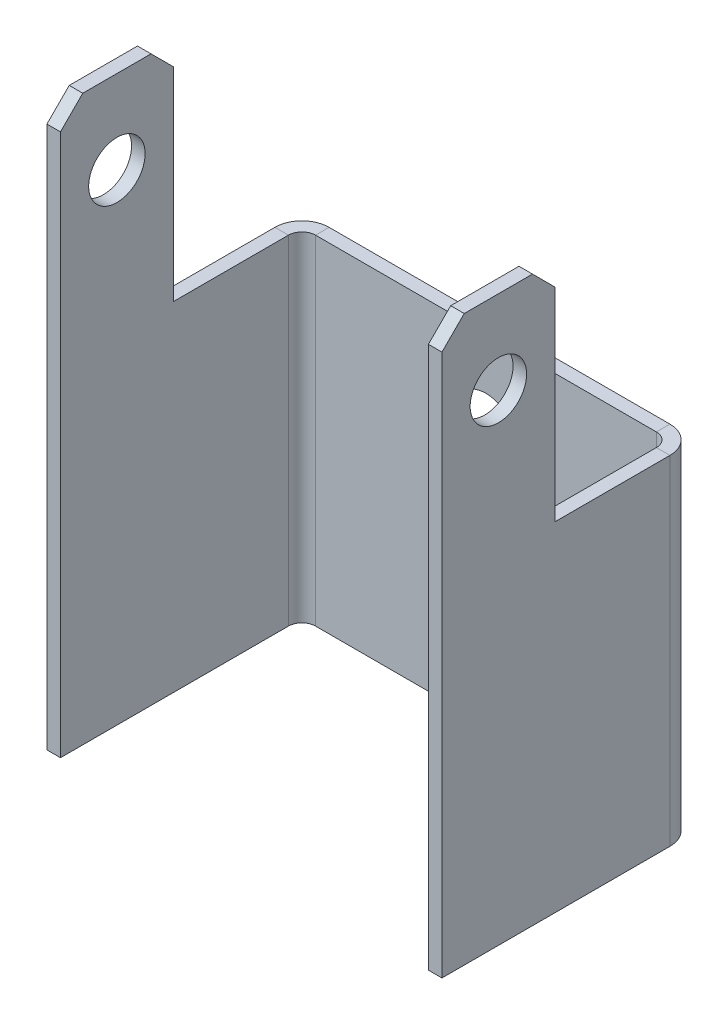
ISO-10303-21;
HEADER;
FILE_DESCRIPTION(('STEP AP214'),'2;1');
FILE_NAME('part.step','',(''),(''),'','','');
FILE_SCHEMA(('AUTOMOTIVE_DESIGN { 1 0 10303 214 1 1 1 1 }'));
ENDSEC;
DATA;
#1=APPLICATION_CONTEXT('core data for automotive mechanical design processes');
#2=APPLICATION_PROTOCOL_DEFINITION('international standard','automotive_design',2000,#1);
#3=PRODUCT_CONTEXT('',#1,'mechanical');
#4=PRODUCT('Part','Part','',(#3));
#5=PRODUCT_RELATED_PRODUCT_CATEGORY('part','',(#4));
#6=PRODUCT_DEFINITION_FORMATION('','',#4);
#7=PRODUCT_DEFINITION_CONTEXT('part definition',#1,'design');
#8=PRODUCT_DEFINITION('design','',#6,#7);
#9=PRODUCT_DEFINITION_SHAPE('','',#8);
#10=(LENGTH_UNIT() NAMED_UNIT(*) SI_UNIT(.MILLI.,.METRE.));
#11=(NAMED_UNIT(*) PLANE_ANGLE_UNIT() SI_UNIT($,.RADIAN.));
#12=(NAMED_UNIT(*) SI_UNIT($,.STERADIAN.) SOLID_ANGLE_UNIT());
#13=UNCERTAINTY_MEASURE_WITH_UNIT(LENGTH_MEASURE(1.E-05),#10,'distance_accuracy_value','');
#14=(GEOMETRIC_REPRESENTATION_CONTEXT(3) GLOBAL_UNCERTAINTY_ASSIGNED_CONTEXT((#13)) GLOBAL_UNIT_ASSIGNED_CONTEXT((#10,
#11,#12)) REPRESENTATION_CONTEXT('',''));
#15=CARTESIAN_POINT('',(0.,0.,0.));
#16=DIRECTION('',(0.,0.,1.));
#17=DIRECTION('',(1.,0.,0.));
#18=AXIS2_PLACEMENT_3D('',#15,#16,#17);
#19=CARTESIAN_POINT('',(-40.513,6.35000000000007,-1.52399999999979));
#20=DIRECTION('',(0.,-1.,0.));
#21=DIRECTION('',(1.,0.,0.));
#22=AXIS2_PLACEMENT_3D('',#19,#20,#21);
#23=PLANE('',#22);
#24=DIRECTION('',(0.,0.,-1.));
#25=VECTOR('',#24,1.);
#26=CARTESIAN_POINT('',(-20.701,6.35000000000007,0.));
#27=LINE('',#26,#25);
#28=CARTESIAN_POINT('',(-20.7010000000001,6.35000000000007,14.4780000000001));
#29=VERTEX_POINT('',#28);
#30=CARTESIAN_POINT('',(-20.701,6.35000000000007,1.52399999999999));
#31=VERTEX_POINT('',#30);
#32=EDGE_CURVE('E326',#29,#31,#27,.T.);
#33=ORIENTED_EDGE('',*,*,#32,.T.);
#34=DIRECTION('',(-1.,0.,0.));
#35=VECTOR('',#34,1.);
#36=CARTESIAN_POINT('',(-20.701,6.35000000000007,1.52399999999999));
#37=LINE('',#36,#35);
#38=CARTESIAN_POINT('',(-22.225,6.35000000000007,1.52399999999999));
#39=VERTEX_POINT('',#38);
#40=EDGE_CURVE('E339',#31,#39,#37,.T.);
#41=ORIENTED_EDGE('',*,*,#40,.T.);
#42=DIRECTION('',(0.,0.,-1.));
#43=VECTOR('',#42,1.);
#44=CARTESIAN_POINT('',(-22.225,6.35000000000007,0.));
#45=LINE('',#44,#43);
#46=CARTESIAN_POINT('',(-22.2250000000001,6.35000000000007,14.4780000000001));
#47=VERTEX_POINT('',#46);
#48=EDGE_CURVE('E407',#47,#39,#45,.T.);
#49=ORIENTED_EDGE('',*,*,#48,.F.);
#50=DIRECTION('',(1.,0.,0.));
#51=VECTOR('',#50,1.);
#52=CARTESIAN_POINT('',(-40.513,6.35000000000006,14.4780000000002));
#53=LINE('',#52,#51);
#54=EDGE_CURVE('E377',#47,#29,#53,.T.);
#55=ORIENTED_EDGE('',*,*,#54,.T.);
#56=EDGE_LOOP('',(#33,#41,#49,#55));
#57=FACE_BOUND('',#56,.T.);
#58=ADVANCED_FACE('F88',(#57),#23,.F.);
#59=DIRECTION('',(1.,0.,0.));
#60=VECTOR('',#59,1.);
#61=CARTESIAN_POINT('',(-40.513,6.35000000000007,-1.52399999999979));
#62=LINE('',#61,#60);
#63=CARTESIAN_POINT('',(-19.177,6.35000000000006,-1.52399999999987));
#64=VERTEX_POINT('',#63);
#65=CARTESIAN_POINT('',(19.177,6.35000000000007,-1.524));
#66=VERTEX_POINT('',#65);
#67=EDGE_CURVE('E323',#64,#66,#62,.T.);
#68=ORIENTED_EDGE('',*,*,#67,.F.);
#69=DIRECTION('',(0.,0.,1.));
#70=VECTOR('',#69,1.);
#71=CARTESIAN_POINT('',(-19.177,6.35000000000006,-1.52399999999987));
#72=LINE('',#71,#70);
#73=CARTESIAN_POINT('',(-19.177,6.35000000000006,0.));
#74=VERTEX_POINT('',#73);
#75=EDGE_CURVE('E336',#64,#74,#72,.T.);
#76=ORIENTED_EDGE('',*,*,#75,.T.);
#77=DIRECTION('',(1.,0.,0.));
#78=VECTOR('',#77,1.);
#79=CARTESIAN_POINT('',(0.,6.35000000000007,0.));
#80=LINE('',#79,#78);
#81=CARTESIAN_POINT('',(19.177,6.35000000000007,0.));
#82=VERTEX_POINT('',#81);
#83=EDGE_CURVE('E389',#74,#82,#80,.T.);
#84=ORIENTED_EDGE('',*,*,#83,.T.);
#85=DIRECTION('',(0.,0.,-1.));
#86=VECTOR('',#85,1.);
#87=CARTESIAN_POINT('',(19.177,6.35000000000007,0.));
#88=LINE('',#87,#86);
#89=EDGE_CURVE('E333',#82,#66,#88,.T.);
#90=ORIENTED_EDGE('',*,*,#89,.T.);
#91=EDGE_LOOP('',(#68,#76,#84,#90));
#92=FACE_BOUND('',#91,.T.);
#93=ADVANCED_FACE('F568',(#92),#23,.F.);
#94=ORIENTED_EDGE('',*,*,#40,.F.);
#95=CARTESIAN_POINT('',(-19.177,6.35000000000006,1.524));
#96=DIRECTION('',(0.,-1.,0.));
#97=DIRECTION('',(1.,0.,0.));
#98=AXIS2_PLACEMENT_3D('',#95,#96,#97);
#99=CIRCLE('',#98,1.524);
#100=EDGE_CURVE('E381',#74,#31,#99,.F.);
#101=ORIENTED_EDGE('',*,*,#100,.F.);
#102=ORIENTED_EDGE('',*,*,#75,.F.);
#103=CARTESIAN_POINT('',(-19.177,6.35000000000006,1.524));
#104=DIRECTION('',(0.,-1.,0.));
#105=DIRECTION('',(1.,0.,0.));
#106=AXIS2_PLACEMENT_3D('',#103,#104,#105);
#107=CIRCLE('',#106,3.048);
#108=EDGE_CURVE('E411',#64,#39,#107,.F.);
#109=ORIENTED_EDGE('',*,*,#108,.T.);
#110=EDGE_LOOP('',(#94,#101,#102,#109));
#111=FACE_BOUND('',#110,.T.);
#112=ADVANCED_FACE('F575',(#111),#23,.F.);
#113=DIRECTION('',(0.,0.,-1.));
#114=VECTOR('',#113,1.);
#115=CARTESIAN_POINT('',(22.225,6.35000000000007,-1.52400000000001));
#116=LINE('',#115,#114);
#117=CARTESIAN_POINT('',(22.225,6.35000000000007,14.478));
#118=VERTEX_POINT('',#117);
#119=CARTESIAN_POINT('',(22.225,6.35000000000007,1.52399999999999));
#120=VERTEX_POINT('',#119);
#121=EDGE_CURVE('E532',#118,#120,#116,.T.);
#122=ORIENTED_EDGE('',*,*,#121,.T.);
#123=DIRECTION('',(-1.,0.,0.));
#124=VECTOR('',#123,1.);
#125=CARTESIAN_POINT('',(22.225,6.35000000000007,1.52399999999999));
#126=LINE('',#125,#124);
#127=CARTESIAN_POINT('',(20.701,6.35000000000007,1.524));
#128=VERTEX_POINT('',#127);
#129=EDGE_CURVE('E330',#120,#128,#126,.T.);
#130=ORIENTED_EDGE('',*,*,#129,.T.);
#131=DIRECTION('',(0.,0.,-1.));
#132=VECTOR('',#131,1.);
#133=CARTESIAN_POINT('',(20.701,6.35000000000007,0.));
#134=LINE('',#133,#132);
#135=CARTESIAN_POINT('',(20.701,6.35000000000007,14.478));
#136=VERTEX_POINT('',#135);
#137=EDGE_CURVE('E403',#136,#128,#134,.T.);
#138=ORIENTED_EDGE('',*,*,#137,.F.);
#139=EDGE_CURVE('E536',#136,#118,#53,.T.);
#140=ORIENTED_EDGE('',*,*,#139,.T.);
#141=EDGE_LOOP('',(#122,#130,#138,#140));
#142=FACE_BOUND('',#141,.T.);
#143=ADVANCED_FACE('F583',(#142),#23,.F.);
#144=CARTESIAN_POINT('',(0.,0.,-1.524));
#145=DIRECTION('',(0.,0.,1.));
#146=DIRECTION('',(1.,0.,0.));
#147=AXIS2_PLACEMENT_3D('',#144,#145,#146);
#148=PLANE('',#147);
#149=CARTESIAN_POINT('',(0.,-22.098,-1.524));
#150=DIRECTION('',(0.,0.,-1.));
#151=DIRECTION('',(-1.,0.,0.));
#152=AXIS2_PLACEMENT_3D('',#149,#150,#151);
#153=CIRCLE('',#152,3.5687);
#154=CARTESIAN_POINT('',(-3.56870000000001,-22.098,-1.524));
#155=VERTEX_POINT('',#154);
#156=EDGE_CURVE('E347',#155,#155,#153,.T.);
#157=ORIENTED_EDGE('',*,*,#156,.F.);
#158=EDGE_LOOP('',(#157));
#159=FACE_BOUND('',#158,.T.);
#160=CARTESIAN_POINT('',(0.,-3.04799999999999,-1.524));
#161=DIRECTION('',(0.,0.,-1.));
#162=DIRECTION('',(-1.,0.,0.));
#163=AXIS2_PLACEMENT_3D('',#160,#161,#162);
#164=CIRCLE('',#163,3.5687);
#165=CARTESIAN_POINT('',(-3.5687,-3.04799999999999,-1.524));
#166=VERTEX_POINT('',#165);
#167=EDGE_CURVE('E523',#166,#166,#164,.T.);
#168=ORIENTED_EDGE('',*,*,#167,.F.);
#169=EDGE_LOOP('',(#168));
#170=FACE_BOUND('',#169,.T.);
#171=DIRECTION('',(0.,-1.,0.));
#172=VECTOR('',#171,1.);
#173=CARTESIAN_POINT('',(-19.177,-31.75,-1.524));
#174=LINE('',#173,#172);
#175=CARTESIAN_POINT('',(-19.177,-31.75,-1.524));
#176=VERTEX_POINT('',#175);
#177=EDGE_CURVE('E453',#176,#64,#174,.F.);
#178=ORIENTED_EDGE('',*,*,#177,.T.);
#179=ORIENTED_EDGE('',*,*,#67,.T.);
#180=DIRECTION('',(0.,1.,0.));
#181=VECTOR('',#180,1.);
#182=CARTESIAN_POINT('',(19.177,31.75,-1.524));
#183=LINE('',#182,#181);
#184=CARTESIAN_POINT('',(19.177,-31.7499999999999,-1.524));
#185=VERTEX_POINT('',#184);
#186=EDGE_CURVE('E292',#66,#185,#183,.F.);
#187=ORIENTED_EDGE('',*,*,#186,.T.);
#188=DIRECTION('',(1.,0.,0.));
#189=VECTOR('',#188,1.);
#190=CARTESIAN_POINT('',(-22.225,-31.75,-1.524));
#191=LINE('',#190,#189);
#192=EDGE_CURVE('E310',#176,#185,#191,.T.);
#193=ORIENTED_EDGE('',*,*,#192,.F.);
#194=EDGE_LOOP('',(#178,#179,#187,#193));
#195=FACE_BOUND('',#194,.T.);
#196=ADVANCED_FACE('F594',(#159,#170,#195),#148,.F.);
#197=CARTESIAN_POINT('',(0.,0.,0.));
#198=DIRECTION('',(0.,0.,1.));
#199=DIRECTION('',(1.,0.,0.));
#200=AXIS2_PLACEMENT_3D('',#197,#198,#199);
#201=PLANE('',#200);
#202=CARTESIAN_POINT('',(0.,-22.098,0.));
#203=DIRECTION('',(0.,0.,1.));
#204=DIRECTION('',(1.,0.,0.));
#205=AXIS2_PLACEMENT_3D('',#202,#203,#204);
#206=CIRCLE('',#205,3.5687);
#207=CARTESIAN_POINT('',(3.56869999999999,-22.098,0.));
#208=VERTEX_POINT('',#207);
#209=EDGE_CURVE('E346',#208,#208,#206,.T.);
#210=ORIENTED_EDGE('',*,*,#209,.F.);
#211=EDGE_LOOP('',(#210));
#212=FACE_BOUND('',#211,.T.);
#213=CARTESIAN_POINT('',(0.,-3.04799999999999,0.));
#214=DIRECTION('',(0.,0.,1.));
#215=DIRECTION('',(1.,0.,0.));
#216=AXIS2_PLACEMENT_3D('',#213,#214,#215);
#217=CIRCLE('',#216,3.5687);
#218=CARTESIAN_POINT('',(3.5687,-3.04799999999999,0.));
#219=VERTEX_POINT('',#218);
#220=EDGE_CURVE('E342',#219,#219,#217,.T.);
#221=ORIENTED_EDGE('',*,*,#220,.F.);
#222=EDGE_LOOP('',(#221));
#223=FACE_BOUND('',#222,.T.);
#224=ORIENTED_EDGE('',*,*,#83,.F.);
#225=DIRECTION('',(0.,-1.,0.));
#226=VECTOR('',#225,1.);
#227=CARTESIAN_POINT('',(-19.177,-31.75,0.));
#228=LINE('',#227,#226);
#229=CARTESIAN_POINT('',(-19.177,-31.75,0.));
#230=VERTEX_POINT('',#229);
#231=EDGE_CURVE('E385',#230,#74,#228,.F.);
#232=ORIENTED_EDGE('',*,*,#231,.F.);
#233=DIRECTION('',(1.,0.,0.));
#234=VECTOR('',#233,1.);
#235=CARTESIAN_POINT('',(-22.225,-31.75,0.));
#236=LINE('',#235,#234);
#237=CARTESIAN_POINT('',(19.177,-31.75,0.));
#238=VERTEX_POINT('',#237);
#239=EDGE_CURVE('E309',#230,#238,#236,.T.);
#240=ORIENTED_EDGE('',*,*,#239,.T.);
#241=DIRECTION('',(0.,1.,0.));
#242=VECTOR('',#241,1.);
#243=CARTESIAN_POINT('',(19.177,31.75,0.));
#244=LINE('',#243,#242);
#245=EDGE_CURVE('E260',#82,#238,#244,.F.);
#246=ORIENTED_EDGE('',*,*,#245,.F.);
#247=EDGE_LOOP('',(#224,#232,#240,#246));
#248=FACE_BOUND('',#247,.T.);
#249=ADVANCED_FACE('F601',(#212,#223,#248),#201,.T.);
#250=CARTESIAN_POINT('',(-22.225,-31.75,-1.524));
#251=DIRECTION('',(0.,-1.,0.));
#252=DIRECTION('',(0.,0.,-1.));
#253=AXIS2_PLACEMENT_3D('',#250,#251,#252);
#254=PLANE('',#253);
#255=ORIENTED_EDGE('',*,*,#239,.F.);
#256=DIRECTION('',(0.,0.,-1.));
#257=VECTOR('',#256,1.);
#258=CARTESIAN_POINT('',(-19.177,-31.75,0.));
#259=LINE('',#258,#257);
#260=EDGE_CURVE('E291',#230,#176,#259,.T.);
#261=ORIENTED_EDGE('',*,*,#260,.T.);
#262=ORIENTED_EDGE('',*,*,#192,.T.);
#263=DIRECTION('',(0.,0.,-1.));
#264=VECTOR('',#263,1.);
#265=CARTESIAN_POINT('',(19.177,-31.75,0.));
#266=LINE('',#265,#264);
#267=EDGE_CURVE('E300',#238,#185,#266,.T.);
#268=ORIENTED_EDGE('',*,*,#267,.F.);
#269=EDGE_LOOP('',(#255,#261,#262,#268));
#270=FACE_BOUND('',#269,.T.);
#271=ADVANCED_FACE('F90',(#270),#254,.T.);
#272=CARTESIAN_POINT('',(19.177,-31.75,1.524));
#273=DIRECTION('',(0.,-1.,0.));
#274=DIRECTION('',(0.,0.,-1.));
#275=AXIS2_PLACEMENT_3D('',#272,#273,#274);
#276=PLANE('',#275);
#277=DIRECTION('',(1.,0.,0.));
#278=VECTOR('',#277,1.);
#279=CARTESIAN_POINT('',(22.225,-31.75,1.52399999999999));
#280=LINE('',#279,#278);
#281=CARTESIAN_POINT('',(20.701,-31.75,1.524));
#282=VERTEX_POINT('',#281);
#283=CARTESIAN_POINT('',(22.225,-31.7499999999999,1.52399999999999));
#284=VERTEX_POINT('',#283);
#285=EDGE_CURVE('E287',#282,#284,#280,.T.);
#286=ORIENTED_EDGE('',*,*,#285,.F.);
#287=CARTESIAN_POINT('',(19.177,-31.75,1.524));
#288=DIRECTION('',(0.,1.,0.));
#289=DIRECTION('',(0.,0.,1.));
#290=AXIS2_PLACEMENT_3D('',#287,#288,#289);
#291=CIRCLE('',#290,1.524);
#292=EDGE_CURVE('E296',#238,#282,#291,.F.);
#293=ORIENTED_EDGE('',*,*,#292,.F.);
#294=ORIENTED_EDGE('',*,*,#267,.T.);
#295=CARTESIAN_POINT('',(19.177,-31.7499999999999,1.524));
#296=DIRECTION('',(0.,1.,0.));
#297=DIRECTION('',(0.,0.,1.));
#298=AXIS2_PLACEMENT_3D('',#295,#296,#297);
#299=CIRCLE('',#298,3.048);
#300=EDGE_CURVE('E295',#185,#284,#299,.F.);
#301=ORIENTED_EDGE('',*,*,#300,.T.);
#302=EDGE_LOOP('',(#286,#293,#294,#301));
#303=FACE_BOUND('',#302,.T.);
#304=ADVANCED_FACE('F629',(#303),#276,.T.);
#305=CARTESIAN_POINT('',(19.177,31.75,1.52400000000001));
#306=DIRECTION('',(0.,1.,0.));
#307=DIRECTION('',(1.,0.,0.));
#308=AXIS2_PLACEMENT_3D('',#305,#306,#307);
#309=CYLINDRICAL_SURFACE('',#308,3.048);
#310=CARTESIAN_POINT('',(19.177,6.35000000000007,1.524));
#311=DIRECTION('',(0.,-1.,0.));
#312=DIRECTION('',(1.,0.,0.));
#313=AXIS2_PLACEMENT_3D('',#310,#311,#312);
#314=CIRCLE('',#313,3.048);
#315=EDGE_CURVE('E414',#120,#66,#314,.F.);
#316=ORIENTED_EDGE('',*,*,#315,.F.);
#317=DIRECTION('',(0.,1.,0.));
#318=VECTOR('',#317,1.);
#319=CARTESIAN_POINT('',(22.225,0.,1.52399999999999));
#320=LINE('',#319,#318);
#321=EDGE_CURVE('E279',#284,#120,#320,.T.);
#322=ORIENTED_EDGE('',*,*,#321,.F.);
#323=ORIENTED_EDGE('',*,*,#300,.F.);
#324=ORIENTED_EDGE('',*,*,#186,.F.);
#325=EDGE_LOOP('',(#316,#322,#323,#324));
#326=FACE_BOUND('',#325,.T.);
#327=ADVANCED_FACE('F610',(#326),#309,.T.);
#328=CARTESIAN_POINT('',(19.177,31.75,1.52400000000001));
#329=DIRECTION('',(0.,1.,0.));
#330=DIRECTION('',(1.,0.,0.));
#331=AXIS2_PLACEMENT_3D('',#328,#329,#330);
#332=CYLINDRICAL_SURFACE('',#331,1.524);
#333=DIRECTION('',(0.,-1.,0.));
#334=VECTOR('',#333,1.);
#335=CARTESIAN_POINT('',(20.701,-31.75,1.52399999999999));
#336=LINE('',#335,#334);
#337=EDGE_CURVE('E283',#282,#128,#336,.F.);
#338=ORIENTED_EDGE('',*,*,#337,.T.);
#339=CARTESIAN_POINT('',(19.177,6.35000000000007,1.524));
#340=DIRECTION('',(0.,-1.,0.));
#341=DIRECTION('',(1.,0.,0.));
#342=AXIS2_PLACEMENT_3D('',#339,#340,#341);
#343=CIRCLE('',#342,1.524);
#344=EDGE_CURVE('E395',#128,#82,#343,.F.);
#345=ORIENTED_EDGE('',*,*,#344,.T.);
#346=ORIENTED_EDGE('',*,*,#245,.T.);
#347=ORIENTED_EDGE('',*,*,#292,.T.);
#348=EDGE_LOOP('',(#338,#345,#346,#347));
#349=FACE_BOUND('',#348,.T.);
#350=ADVANCED_FACE('F625',(#349),#332,.F.);
#351=CARTESIAN_POINT('',(22.225,31.75,0.));
#352=DIRECTION('',(0.,1.,0.));
#353=DIRECTION('',(-1.,0.,0.));
#354=AXIS2_PLACEMENT_3D('',#351,#352,#353);
#355=PLANE('',#354);
#356=DIRECTION('',(1.,0.,0.));
#357=VECTOR('',#356,1.);
#358=CARTESIAN_POINT('',(-40.513,31.75,16.9869149123667));
#359=LINE('',#358,#357);
#360=CARTESIAN_POINT('',(20.701,31.75,16.9869149123665));
#361=VERTEX_POINT('',#360);
#362=CARTESIAN_POINT('',(22.225,31.75,16.9869149123665));
#363=VERTEX_POINT('',#362);
#364=EDGE_CURVE('E224',#361,#363,#359,.T.);
#365=ORIENTED_EDGE('',*,*,#364,.F.);
#366=DIRECTION('',(0.,0.,1.));
#367=VECTOR('',#366,1.);
#368=CARTESIAN_POINT('',(20.701,31.75,0.));
#369=LINE('',#368,#367);
#370=CARTESIAN_POINT('',(20.7010000000001,31.75,24.6690850876336));
#371=VERTEX_POINT('',#370);
#372=EDGE_CURVE('E269',#371,#361,#369,.F.);
#373=ORIENTED_EDGE('',*,*,#372,.F.);
#374=DIRECTION('',(1.,0.,0.));
#375=VECTOR('',#374,1.);
#376=CARTESIAN_POINT('',(-40.5129999999999,31.75,24.6690850876338));
#377=LINE('',#376,#375);
#378=CARTESIAN_POINT('',(22.2250000000001,31.75,24.6690850876336));
#379=VERTEX_POINT('',#378);
#380=EDGE_CURVE('E252',#371,#379,#377,.T.);
#381=ORIENTED_EDGE('',*,*,#380,.T.);
#382=DIRECTION('',(0.,0.,-1.));
#383=VECTOR('',#382,1.);
#384=CARTESIAN_POINT('',(22.225,31.75,0.));
#385=LINE('',#384,#383);
#386=EDGE_CURVE('E244',#379,#363,#385,.T.);
#387=ORIENTED_EDGE('',*,*,#386,.T.);
#388=EDGE_LOOP('',(#365,#373,#381,#387));
#389=FACE_BOUND('',#388,.T.);
#390=ADVANCED_FACE('F251',(#389),#355,.T.);
#391=CARTESIAN_POINT('',(22.2250000000001,-31.75,27.178));
#392=DIRECTION('',(0.,-1.,0.));
#393=DIRECTION('',(1.,0.,0.));
#394=AXIS2_PLACEMENT_3D('',#391,#392,#393);
#395=PLANE('',#394);
#396=DIRECTION('',(0.,0.,-1.));
#397=VECTOR('',#396,1.);
#398=CARTESIAN_POINT('',(20.701,-31.75,0.));
#399=LINE('',#398,#397);
#400=CARTESIAN_POINT('',(20.7010000000001,-31.75,27.178));
#401=VERTEX_POINT('',#400);
#402=EDGE_CURVE('E276',#282,#401,#399,.F.);
#403=ORIENTED_EDGE('',*,*,#402,.F.);
#404=ORIENTED_EDGE('',*,*,#285,.T.);
#405=DIRECTION('',(0.,0.,1.));
#406=VECTOR('',#405,1.);
#407=CARTESIAN_POINT('',(22.2250000000001,-31.75,27.178));
#408=LINE('',#407,#406);
#409=CARTESIAN_POINT('',(22.2250000000001,-31.75,27.178));
#410=VERTEX_POINT('',#409);
#411=EDGE_CURVE('E263',#284,#410,#408,.T.);
#412=ORIENTED_EDGE('',*,*,#411,.T.);
#413=DIRECTION('',(-1.,0.,0.));
#414=VECTOR('',#413,1.);
#415=CARTESIAN_POINT('',(22.2250000000001,-31.75,27.178));
#416=LINE('',#415,#414);
#417=EDGE_CURVE('E254',#410,#401,#416,.T.);
#418=ORIENTED_EDGE('',*,*,#417,.T.);
#419=EDGE_LOOP('',(#403,#404,#412,#418));
#420=FACE_BOUND('',#419,.T.);
#421=ADVANCED_FACE('F617',(#420),#395,.T.);
#422=CARTESIAN_POINT('',(22.225,0.,0.));
#423=DIRECTION('',(1.,0.,0.));
#424=DIRECTION('',(0.,0.,-1.));
#425=AXIS2_PLACEMENT_3D('',#422,#423,#424);
#426=PLANE('',#425);
#427=DIRECTION('',(0.,-0.707106781186543,-0.707106781186552));
#428=VECTOR('',#427,1.);
#429=CARTESIAN_POINT('',(22.225,29.2410850876336,14.478));
#430=LINE('',#429,#428);
#431=CARTESIAN_POINT('',(22.225,29.2410850876336,14.478));
#432=VERTEX_POINT('',#431);
#433=EDGE_CURVE('E227',#363,#432,#430,.T.);
#434=ORIENTED_EDGE('',*,*,#433,.F.);
#435=ORIENTED_EDGE('',*,*,#386,.F.);
#436=DIRECTION('',(0.,0.707106781186554,-0.707106781186541));
#437=VECTOR('',#436,1.);
#438=CARTESIAN_POINT('',(22.2250000000001,29.2410850876336,27.178));
#439=LINE('',#438,#437);
#440=CARTESIAN_POINT('',(22.2250000000001,29.2410850876336,27.178));
#441=VERTEX_POINT('',#440);
#442=EDGE_CURVE('E248',#441,#379,#439,.T.);
#443=ORIENTED_EDGE('',*,*,#442,.F.);
#444=DIRECTION('',(0.,1.,0.));
#445=VECTOR('',#444,1.);
#446=CARTESIAN_POINT('',(22.2250000000001,31.75,27.178));
#447=LINE('',#446,#445);
#448=EDGE_CURVE('E255',#410,#441,#447,.T.);
#449=ORIENTED_EDGE('',*,*,#448,.F.);
#450=ORIENTED_EDGE('',*,*,#411,.F.);
#451=ORIENTED_EDGE('',*,*,#321,.T.);
#452=ORIENTED_EDGE('',*,*,#121,.F.);
#453=DIRECTION('',(0.,-1.,0.));
#454=VECTOR('',#453,1.);
#455=CARTESIAN_POINT('',(22.225,31.75,14.478));
#456=LINE('',#455,#454);
#457=EDGE_CURVE('E246',#432,#118,#456,.T.);
#458=ORIENTED_EDGE('',*,*,#457,.F.);
#459=EDGE_LOOP('',(#434,#435,#443,#449,#450,#451,#452,#458));
#460=FACE_BOUND('',#459,.T.);
#461=CARTESIAN_POINT('',(22.2250000000001,22.3520000000001,20.828));
#462=DIRECTION('',(1.,0.,0.));
#463=DIRECTION('',(0.,0.,-1.));
#464=AXIS2_PLACEMENT_3D('',#461,#462,#463);
#465=CIRCLE('',#464,3.175);
#466=CARTESIAN_POINT('',(22.225,22.3520000000001,17.653));
#467=VERTEX_POINT('',#466);
#468=EDGE_CURVE('E350',#467,#467,#465,.T.);
#469=ORIENTED_EDGE('',*,*,#468,.F.);
#470=EDGE_LOOP('',(#469));
#471=FACE_BOUND('',#470,.T.);
#472=ADVANCED_FACE('F241',(#460,#471),#426,.T.);
#473=CARTESIAN_POINT('',(20.701,0.,0.));
#474=DIRECTION('',(1.,0.,0.));
#475=DIRECTION('',(0.,0.,-1.));
#476=AXIS2_PLACEMENT_3D('',#473,#474,#475);
#477=PLANE('',#476);
#478=CARTESIAN_POINT('',(20.7010000000001,22.3520000000001,20.828));
#479=DIRECTION('',(1.,0.,0.));
#480=DIRECTION('',(0.,0.,-1.));
#481=AXIS2_PLACEMENT_3D('',#478,#479,#480);
#482=CIRCLE('',#481,3.175);
#483=CARTESIAN_POINT('',(20.701,22.3520000000001,17.653));
#484=VERTEX_POINT('',#483);
#485=EDGE_CURVE('E548',#484,#484,#482,.T.);
#486=ORIENTED_EDGE('',*,*,#485,.T.);
#487=EDGE_LOOP('',(#486));
#488=FACE_BOUND('',#487,.T.);
#489=ORIENTED_EDGE('',*,*,#372,.T.);
#490=DIRECTION('',(0.,-0.707106781186543,-0.707106781186552));
#491=VECTOR('',#490,1.);
#492=CARTESIAN_POINT('',(20.701,7.38154254381693,-7.38154254381691));
#493=LINE('',#492,#491);
#494=CARTESIAN_POINT('',(20.701,29.2410850876336,14.478));
#495=VERTEX_POINT('',#494);
#496=EDGE_CURVE('E230',#361,#495,#493,.T.);
#497=ORIENTED_EDGE('',*,*,#496,.T.);
#498=DIRECTION('',(0.,-1.,0.));
#499=VECTOR('',#498,1.);
#500=CARTESIAN_POINT('',(20.701,0.,14.478));
#501=LINE('',#500,#499);
#502=EDGE_CURVE('E390',#495,#136,#501,.T.);
#503=ORIENTED_EDGE('',*,*,#502,.T.);
#504=ORIENTED_EDGE('',*,*,#137,.T.);
#505=ORIENTED_EDGE('',*,*,#337,.F.);
#506=ORIENTED_EDGE('',*,*,#402,.T.);
#507=DIRECTION('',(0.,-1.,0.));
#508=VECTOR('',#507,1.);
#509=CARTESIAN_POINT('',(20.7010000000001,0.,27.178));
#510=LINE('',#509,#508);
#511=CARTESIAN_POINT('',(20.7010000000001,29.2410850876336,27.178));
#512=VERTEX_POINT('',#511);
#513=EDGE_CURVE('E272',#401,#512,#510,.F.);
#514=ORIENTED_EDGE('',*,*,#513,.T.);
#515=DIRECTION('',(0.,0.707106781186554,-0.707106781186541));
#516=VECTOR('',#515,1.);
#517=CARTESIAN_POINT('',(20.7010000000001,28.2095425438165,28.209542543817));
#518=LINE('',#517,#516);
#519=EDGE_CURVE('E104',#512,#371,#518,.T.);
#520=ORIENTED_EDGE('',*,*,#519,.T.);
#521=EDGE_LOOP('',(#489,#497,#503,#504,#505,#506,#514,#520));
#522=FACE_BOUND('',#521,.T.);
#523=ADVANCED_FACE('F622',(#488,#522),#477,.F.);
#524=CARTESIAN_POINT('',(22.2250000000001,31.75,27.178));
#525=DIRECTION('',(0.,0.,1.));
#526=DIRECTION('',(1.,0.,0.));
#527=AXIS2_PLACEMENT_3D('',#524,#525,#526);
#528=PLANE('',#527);
#529=DIRECTION('',(1.,0.,0.));
#530=VECTOR('',#529,1.);
#531=CARTESIAN_POINT('',(-40.5129999999999,29.2410850876336,27.1780000000002));
#532=LINE('',#531,#530);
#533=EDGE_CURVE('E505',#512,#441,#532,.T.);
#534=ORIENTED_EDGE('',*,*,#533,.F.);
#535=ORIENTED_EDGE('',*,*,#513,.F.);
#536=ORIENTED_EDGE('',*,*,#417,.F.);
#537=ORIENTED_EDGE('',*,*,#448,.T.);
#538=EDGE_LOOP('',(#534,#535,#536,#537));
#539=FACE_BOUND('',#538,.T.);
#540=ADVANCED_FACE('F620',(#539),#528,.T.);
#541=CARTESIAN_POINT('',(-19.177,-31.75,1.524));
#542=DIRECTION('',(0.,1.,0.));
#543=DIRECTION('',(0.,0.,1.));
#544=AXIS2_PLACEMENT_3D('',#541,#542,#543);
#545=PLANE('',#544);
#546=CARTESIAN_POINT('',(-19.177,-31.75,1.524));
#547=DIRECTION('',(0.,-1.,0.));
#548=DIRECTION('',(0.,0.,-1.));
#549=AXIS2_PLACEMENT_3D('',#546,#547,#548);
#550=CIRCLE('',#549,1.524);
#551=CARTESIAN_POINT('',(-20.701,-31.75,1.524));
#552=VERTEX_POINT('',#551);
#553=EDGE_CURVE('E422',#552,#230,#550,.T.);
#554=ORIENTED_EDGE('',*,*,#553,.F.);
#555=DIRECTION('',(-1.,0.,0.));
#556=VECTOR('',#555,1.);
#557=CARTESIAN_POINT('',(-20.701,-31.75,1.524));
#558=LINE('',#557,#556);
#559=CARTESIAN_POINT('',(-22.225,-31.75,1.52399999999999));
#560=VERTEX_POINT('',#559);
#561=EDGE_CURVE('E447',#552,#560,#558,.T.);
#562=ORIENTED_EDGE('',*,*,#561,.T.);
#563=CARTESIAN_POINT('',(-19.177,-31.75,1.524));
#564=DIRECTION('',(0.,-1.,0.));
#565=DIRECTION('',(0.,0.,-1.));
#566=AXIS2_PLACEMENT_3D('',#563,#564,#565);
#567=CIRCLE('',#566,3.048);
#568=EDGE_CURVE('E457',#560,#176,#567,.T.);
#569=ORIENTED_EDGE('',*,*,#568,.T.);
#570=ORIENTED_EDGE('',*,*,#260,.F.);
#571=EDGE_LOOP('',(#554,#562,#569,#570));
#572=FACE_BOUND('',#571,.T.);
#573=ADVANCED_FACE('F477',(#572),#545,.F.);
#574=CARTESIAN_POINT('',(-19.177,-31.75,1.524));
#575=DIRECTION('',(0.,-1.,0.));
#576=DIRECTION('',(-1.,0.,0.));
#577=AXIS2_PLACEMENT_3D('',#574,#575,#576);
#578=CYLINDRICAL_SURFACE('',#577,3.048);
#579=ORIENTED_EDGE('',*,*,#108,.F.);
#580=ORIENTED_EDGE('',*,*,#177,.F.);
#581=ORIENTED_EDGE('',*,*,#568,.F.);
#582=DIRECTION('',(0.,-1.,0.));
#583=VECTOR('',#582,1.);
#584=CARTESIAN_POINT('',(-22.225,31.75,1.52399999999999));
#585=LINE('',#584,#583);
#586=EDGE_CURVE('E443',#560,#39,#585,.F.);
#587=ORIENTED_EDGE('',*,*,#586,.T.);
#588=EDGE_LOOP('',(#579,#580,#581,#587));
#589=FACE_BOUND('',#588,.T.);
#590=ADVANCED_FACE('F474',(#589),#578,.T.);
#591=CARTESIAN_POINT('',(-19.177,-31.75,1.524));
#592=DIRECTION('',(0.,-1.,0.));
#593=DIRECTION('',(-1.,0.,0.));
#594=AXIS2_PLACEMENT_3D('',#591,#592,#593);
#595=CYLINDRICAL_SURFACE('',#594,1.524);
#596=ORIENTED_EDGE('',*,*,#231,.T.);
#597=ORIENTED_EDGE('',*,*,#100,.T.);
#598=DIRECTION('',(0.,-1.,0.));
#599=VECTOR('',#598,1.);
#600=CARTESIAN_POINT('',(-20.701,31.75,1.52399999999999));
#601=LINE('',#600,#599);
#602=EDGE_CURVE('E372',#31,#552,#601,.T.);
#603=ORIENTED_EDGE('',*,*,#602,.T.);
#604=ORIENTED_EDGE('',*,*,#553,.T.);
#605=EDGE_LOOP('',(#596,#597,#603,#604));
#606=FACE_BOUND('',#605,.T.);
#607=ADVANCED_FACE('F382',(#606),#595,.F.);
#608=CARTESIAN_POINT('',(-22.225,31.75,0.));
#609=DIRECTION('',(0.,1.,0.));
#610=DIRECTION('',(-1.,0.,0.));
#611=AXIS2_PLACEMENT_3D('',#608,#609,#610);
#612=PLANE('',#611);
#613=CARTESIAN_POINT('',(-22.2250000000001,31.75,16.9869149123666));
#614=VERTEX_POINT('',#613);
#615=CARTESIAN_POINT('',(-20.7010000000001,31.75,16.9869149123666));
#616=VERTEX_POINT('',#615);
#617=EDGE_CURVE('E236',#614,#616,#359,.T.);
#618=ORIENTED_EDGE('',*,*,#617,.F.);
#619=DIRECTION('',(0.,0.,-1.));
#620=VECTOR('',#619,1.);
#621=CARTESIAN_POINT('',(-22.225,31.75,0.));
#622=LINE('',#621,#620);
#623=CARTESIAN_POINT('',(-22.2250000000001,31.75,24.6690850876338));
#624=VERTEX_POINT('',#623);
#625=EDGE_CURVE('E430',#614,#624,#622,.F.);
#626=ORIENTED_EDGE('',*,*,#625,.T.);
#627=CARTESIAN_POINT('',(-20.7010000000001,31.75,24.6690850876338));
#628=VERTEX_POINT('',#627);
#629=EDGE_CURVE('E499',#624,#628,#377,.T.);
#630=ORIENTED_EDGE('',*,*,#629,.T.);
#631=DIRECTION('',(0.,0.,1.));
#632=VECTOR('',#631,1.);
#633=CARTESIAN_POINT('',(-20.701,31.75,0.));
#634=LINE('',#633,#632);
#635=EDGE_CURVE('E440',#616,#628,#634,.T.);
#636=ORIENTED_EDGE('',*,*,#635,.F.);
#637=EDGE_LOOP('',(#618,#626,#630,#636));
#638=FACE_BOUND('',#637,.T.);
#639=ADVANCED_FACE('F498',(#638),#612,.T.);
#640=CARTESIAN_POINT('',(-22.2250000000001,-31.75,27.178));
#641=DIRECTION('',(0.,-1.,0.));
#642=DIRECTION('',(1.,0.,0.));
#643=AXIS2_PLACEMENT_3D('',#640,#641,#642);
#644=PLANE('',#643);
#645=DIRECTION('',(0.,0.,1.));
#646=VECTOR('',#645,1.);
#647=CARTESIAN_POINT('',(-22.2250000000001,-31.75,27.178));
#648=LINE('',#647,#646);
#649=CARTESIAN_POINT('',(-22.2250000000001,-31.75,27.178));
#650=VERTEX_POINT('',#649);
#651=EDGE_CURVE('E423',#650,#560,#648,.F.);
#652=ORIENTED_EDGE('',*,*,#651,.T.);
#653=ORIENTED_EDGE('',*,*,#561,.F.);
#654=DIRECTION('',(0.,0.,-1.));
#655=VECTOR('',#654,1.);
#656=CARTESIAN_POINT('',(-20.701,-31.75,0.));
#657=LINE('',#656,#655);
#658=CARTESIAN_POINT('',(-20.7010000000001,-31.75,27.178));
#659=VERTEX_POINT('',#658);
#660=EDGE_CURVE('E434',#659,#552,#657,.T.);
#661=ORIENTED_EDGE('',*,*,#660,.F.);
#662=DIRECTION('',(1.,0.,0.));
#663=VECTOR('',#662,1.);
#664=CARTESIAN_POINT('',(-22.2250000000001,-31.75,27.178));
#665=LINE('',#664,#663);
#666=EDGE_CURVE('E418',#650,#659,#665,.T.);
#667=ORIENTED_EDGE('',*,*,#666,.F.);
#668=EDGE_LOOP('',(#652,#653,#661,#667));
#669=FACE_BOUND('',#668,.T.);
#670=ADVANCED_FACE('F488',(#669),#644,.T.);
#671=CARTESIAN_POINT('',(-22.225,0.,0.));
#672=DIRECTION('',(1.,0.,0.));
#673=DIRECTION('',(0.,0.,-1.));
#674=AXIS2_PLACEMENT_3D('',#671,#672,#673);
#675=PLANE('',#674);
#676=CARTESIAN_POINT('',(-22.2250000000001,22.3520000000001,20.8280000000001));
#677=DIRECTION('',(1.,0.,0.));
#678=DIRECTION('',(0.,0.,-1.));
#679=AXIS2_PLACEMENT_3D('',#676,#677,#678);
#680=CIRCLE('',#679,3.175);
#681=CARTESIAN_POINT('',(-22.2250000000001,22.3520000000001,17.6530000000001));
#682=VERTEX_POINT('',#681);
#683=EDGE_CURVE('E322',#682,#682,#680,.T.);
#684=ORIENTED_EDGE('',*,*,#683,.T.);
#685=EDGE_LOOP('',(#684));
#686=FACE_BOUND('',#685,.T.);
#687=ORIENTED_EDGE('',*,*,#625,.F.);
#688=DIRECTION('',(0.,-0.707106781186543,-0.707106781186552));
#689=VECTOR('',#688,1.);
#690=CARTESIAN_POINT('',(-22.225,7.38154254381684,-7.38154254381684));
#691=LINE('',#690,#689);
#692=CARTESIAN_POINT('',(-22.2250000000001,29.2410850876336,14.4780000000001));
#693=VERTEX_POINT('',#692);
#694=EDGE_CURVE('E514',#614,#693,#691,.T.);
#695=ORIENTED_EDGE('',*,*,#694,.T.);
#696=DIRECTION('',(0.,-1.,0.));
#697=VECTOR('',#696,1.);
#698=CARTESIAN_POINT('',(-22.2250000000001,0.,14.4780000000001));
#699=LINE('',#698,#697);
#700=EDGE_CURVE('E359',#693,#47,#699,.T.);
#701=ORIENTED_EDGE('',*,*,#700,.T.);
#702=ORIENTED_EDGE('',*,*,#48,.T.);
#703=ORIENTED_EDGE('',*,*,#586,.F.);
#704=ORIENTED_EDGE('',*,*,#651,.F.);
#705=DIRECTION('',(0.,1.,0.));
#706=VECTOR('',#705,1.);
#707=CARTESIAN_POINT('',(-22.2250000000001,31.75,27.178));
#708=LINE('',#707,#706);
#709=CARTESIAN_POINT('',(-22.2250000000001,29.2410850876337,27.178));
#710=VERTEX_POINT('',#709);
#711=EDGE_CURVE('E427',#710,#650,#708,.F.);
#712=ORIENTED_EDGE('',*,*,#711,.F.);
#713=DIRECTION('',(0.,0.707106781186554,-0.707106781186541));
#714=VECTOR('',#713,1.);
#715=CARTESIAN_POINT('',(-22.2250000000001,28.2095425438166,28.2095425438171));
#716=LINE('',#715,#714);
#717=EDGE_CURVE('E111',#710,#624,#716,.T.);
#718=ORIENTED_EDGE('',*,*,#717,.T.);
#719=EDGE_LOOP('',(#687,#695,#701,#702,#703,#704,#712,#718));
#720=FACE_BOUND('',#719,.T.);
#721=ADVANCED_FACE('F485',(#686,#720),#675,.F.);
#722=CARTESIAN_POINT('',(-20.701,0.,0.));
#723=DIRECTION('',(1.,0.,0.));
#724=DIRECTION('',(0.,0.,-1.));
#725=AXIS2_PLACEMENT_3D('',#722,#723,#724);
#726=PLANE('',#725);
#727=DIRECTION('',(0.,-0.707106781186543,-0.707106781186552));
#728=VECTOR('',#727,1.);
#729=CARTESIAN_POINT('',(-20.701,7.38154254381685,-7.38154254381684));
#730=LINE('',#729,#728);
#731=CARTESIAN_POINT('',(-20.7010000000001,29.2410850876336,14.4780000000001));
#732=VERTEX_POINT('',#731);
#733=EDGE_CURVE('E368',#616,#732,#730,.T.);
#734=ORIENTED_EDGE('',*,*,#733,.F.);
#735=ORIENTED_EDGE('',*,*,#635,.T.);
#736=DIRECTION('',(0.,0.707106781186554,-0.707106781186541));
#737=VECTOR('',#736,1.);
#738=CARTESIAN_POINT('',(-20.7010000000001,28.2095425438166,28.2095425438171));
#739=LINE('',#738,#737);
#740=CARTESIAN_POINT('',(-20.7010000000001,29.2410850876336,27.1780000000001));
#741=VERTEX_POINT('',#740);
#742=EDGE_CURVE('E493',#741,#628,#739,.T.);
#743=ORIENTED_EDGE('',*,*,#742,.F.);
#744=DIRECTION('',(0.,-1.,0.));
#745=VECTOR('',#744,1.);
#746=CARTESIAN_POINT('',(-20.7010000000001,0.,27.178));
#747=LINE('',#746,#745);
#748=EDGE_CURVE('E437',#741,#659,#747,.T.);
#749=ORIENTED_EDGE('',*,*,#748,.T.);
#750=ORIENTED_EDGE('',*,*,#660,.T.);
#751=ORIENTED_EDGE('',*,*,#602,.F.);
#752=ORIENTED_EDGE('',*,*,#32,.F.);
#753=DIRECTION('',(0.,-1.,0.));
#754=VECTOR('',#753,1.);
#755=CARTESIAN_POINT('',(-20.7010000000001,0.,14.4780000000001));
#756=LINE('',#755,#754);
#757=EDGE_CURVE('E314',#732,#29,#756,.T.);
#758=ORIENTED_EDGE('',*,*,#757,.F.);
#759=EDGE_LOOP('',(#734,#735,#743,#749,#750,#751,#752,#758));
#760=FACE_BOUND('',#759,.T.);
#761=CARTESIAN_POINT('',(-20.7010000000001,22.3520000000001,20.8280000000001));
#762=DIRECTION('',(1.,0.,0.));
#763=DIRECTION('',(0.,0.,-1.));
#764=AXIS2_PLACEMENT_3D('',#761,#762,#763);
#765=CIRCLE('',#764,3.175);
#766=CARTESIAN_POINT('',(-20.7010000000001,22.3520000000001,17.6530000000001));
#767=VERTEX_POINT('',#766);
#768=EDGE_CURVE('E318',#767,#767,#765,.T.);
#769=ORIENTED_EDGE('',*,*,#768,.F.);
#770=EDGE_LOOP('',(#769));
#771=FACE_BOUND('',#770,.T.);
#772=ADVANCED_FACE('F365',(#760,#771),#726,.T.);
#773=CARTESIAN_POINT('',(-22.2250000000001,31.75,27.178));
#774=DIRECTION('',(0.,0.,1.));
#775=DIRECTION('',(1.,0.,0.));
#776=AXIS2_PLACEMENT_3D('',#773,#774,#775);
#777=PLANE('',#776);
#778=DIRECTION('',(1.,0.,0.));
#779=VECTOR('',#778,1.);
#780=CARTESIAN_POINT('',(-22.2250000000001,29.2410850876337,27.178));
#781=LINE('',#780,#779);
#782=EDGE_CURVE('E13',#710,#741,#781,.T.);
#783=ORIENTED_EDGE('',*,*,#782,.F.);
#784=ORIENTED_EDGE('',*,*,#711,.T.);
#785=ORIENTED_EDGE('',*,*,#666,.T.);
#786=ORIENTED_EDGE('',*,*,#748,.F.);
#787=EDGE_LOOP('',(#783,#784,#785,#786));
#788=FACE_BOUND('',#787,.T.);
#789=ADVANCED_FACE('F491',(#788),#777,.T.);
#790=CARTESIAN_POINT('',(-40.513,22.3520000000001,20.8280000000002));
#791=DIRECTION('',(1.,0.,0.));
#792=DIRECTION('',(0.,0.,-1.));
#793=AXIS2_PLACEMENT_3D('',#790,#791,#792);
#794=CYLINDRICAL_SURFACE('',#793,3.175);
#795=ORIENTED_EDGE('',*,*,#768,.T.);
#796=EDGE_LOOP('',(#795));
#797=FACE_BOUND('',#796,.T.);
#798=ORIENTED_EDGE('',*,*,#683,.F.);
#799=EDGE_LOOP('',(#798));
#800=FACE_BOUND('',#799,.T.);
#801=ADVANCED_FACE('F581',(#797,#800),#794,.F.);
#802=ORIENTED_EDGE('',*,*,#89,.F.);
#803=ORIENTED_EDGE('',*,*,#344,.F.);
#804=ORIENTED_EDGE('',*,*,#129,.F.);
#805=ORIENTED_EDGE('',*,*,#315,.T.);
#806=EDGE_LOOP('',(#802,#803,#804,#805));
#807=FACE_BOUND('',#806,.T.);
#808=ADVANCED_FACE('F570',(#807),#23,.F.);
#809=CARTESIAN_POINT('',(-40.513,31.75,14.4780000000002));
#810=DIRECTION('',(0.,0.,1.));
#811=DIRECTION('',(1.,0.,0.));
#812=AXIS2_PLACEMENT_3D('',#809,#810,#811);
#813=PLANE('',#812);
#814=ORIENTED_EDGE('',*,*,#502,.F.);
#815=DIRECTION('',(1.,0.,0.));
#816=VECTOR('',#815,1.);
#817=CARTESIAN_POINT('',(-40.513,29.2410850876336,14.4780000000002));
#818=LINE('',#817,#816);
#819=EDGE_CURVE('E501',#495,#432,#818,.T.);
#820=ORIENTED_EDGE('',*,*,#819,.T.);
#821=ORIENTED_EDGE('',*,*,#457,.T.);
#822=ORIENTED_EDGE('',*,*,#139,.F.);
#823=EDGE_LOOP('',(#814,#820,#821,#822));
#824=FACE_BOUND('',#823,.T.);
#825=ADVANCED_FACE('F580',(#824),#813,.F.);
#826=ORIENTED_EDGE('',*,*,#700,.F.);
#827=DIRECTION('',(1.,0.,0.));
#828=VECTOR('',#827,1.);
#829=CARTESIAN_POINT('',(-40.513,29.2410850876336,14.4780000000002));
#830=LINE('',#829,#828);
#831=EDGE_CURVE('E97',#693,#732,#830,.T.);
#832=ORIENTED_EDGE('',*,*,#831,.T.);
#833=ORIENTED_EDGE('',*,*,#757,.T.);
#834=ORIENTED_EDGE('',*,*,#54,.F.);
#835=EDGE_LOOP('',(#826,#832,#833,#834));
#836=FACE_BOUND('',#835,.T.);
#837=ADVANCED_FACE('F356',(#836),#813,.F.);
#838=ORIENTED_EDGE('',*,*,#468,.T.);
#839=EDGE_LOOP('',(#838));
#840=FACE_BOUND('',#839,.T.);
#841=ORIENTED_EDGE('',*,*,#485,.F.);
#842=EDGE_LOOP('',(#841));
#843=FACE_BOUND('',#842,.T.);
#844=ADVANCED_FACE('F592',(#840,#843),#794,.F.);
#845=CARTESIAN_POINT('',(0.,-3.04799999999999,61.214));
#846=DIRECTION('',(0.,0.,-1.));
#847=DIRECTION('',(-1.,0.,0.));
#848=AXIS2_PLACEMENT_3D('',#845,#846,#847);
#849=CYLINDRICAL_SURFACE('',#848,3.5687);
#850=ORIENTED_EDGE('',*,*,#220,.T.);
#851=EDGE_LOOP('',(#850));
#852=FACE_BOUND('',#851,.T.);
#853=ORIENTED_EDGE('',*,*,#167,.T.);
#854=EDGE_LOOP('',(#853));
#855=FACE_BOUND('',#854,.T.);
#856=ADVANCED_FACE('F563',(#852,#855),#849,.F.);
#857=CARTESIAN_POINT('',(0.,-22.098,61.214));
#858=DIRECTION('',(0.,0.,-1.));
#859=DIRECTION('',(-1.,0.,0.));
#860=AXIS2_PLACEMENT_3D('',#857,#858,#859);
#861=CYLINDRICAL_SURFACE('',#860,3.5687);
#862=ORIENTED_EDGE('',*,*,#209,.T.);
#863=EDGE_LOOP('',(#862));
#864=FACE_BOUND('',#863,.T.);
#865=ORIENTED_EDGE('',*,*,#156,.T.);
#866=EDGE_LOOP('',(#865));
#867=FACE_BOUND('',#866,.T.);
#868=ADVANCED_FACE('F555',(#864,#867),#861,.F.);
#869=CARTESIAN_POINT('',(-40.513,29.2410850876336,14.4780000000002));
#870=DIRECTION('',(0.,-0.707106781186552,0.707106781186543));
#871=DIRECTION('',(0.,-0.707106781186543,-0.707106781186552));
#872=AXIS2_PLACEMENT_3D('',#869,#870,#871);
#873=PLANE('',#872);
#874=ORIENTED_EDGE('',*,*,#617,.T.);
#875=ORIENTED_EDGE('',*,*,#733,.T.);
#876=ORIENTED_EDGE('',*,*,#831,.F.);
#877=ORIENTED_EDGE('',*,*,#694,.F.);
#878=EDGE_LOOP('',(#874,#875,#876,#877));
#879=FACE_BOUND('',#878,.T.);
#880=ADVANCED_FACE('F553',(#879),#873,.F.);
#881=ORIENTED_EDGE('',*,*,#364,.T.);
#882=ORIENTED_EDGE('',*,*,#433,.T.);
#883=ORIENTED_EDGE('',*,*,#819,.F.);
#884=ORIENTED_EDGE('',*,*,#496,.F.);
#885=EDGE_LOOP('',(#881,#882,#883,#884));
#886=FACE_BOUND('',#885,.T.);
#887=ADVANCED_FACE('F226',(#886),#873,.F.);
#888=CARTESIAN_POINT('',(-40.5129999999999,29.2410850876336,27.1780000000002));
#889=DIRECTION('',(0.,-0.707106781186541,-0.707106781186554));
#890=DIRECTION('',(0.,0.707106781186554,-0.707106781186541));
#891=AXIS2_PLACEMENT_3D('',#888,#889,#890);
#892=PLANE('',#891);
#893=ORIENTED_EDGE('',*,*,#782,.T.);
#894=ORIENTED_EDGE('',*,*,#742,.T.);
#895=ORIENTED_EDGE('',*,*,#629,.F.);
#896=ORIENTED_EDGE('',*,*,#717,.F.);
#897=EDGE_LOOP('',(#893,#894,#895,#896));
#898=FACE_BOUND('',#897,.T.);
#899=ADVANCED_FACE('F561',(#898),#892,.F.);
#900=ORIENTED_EDGE('',*,*,#533,.T.);
#901=ORIENTED_EDGE('',*,*,#442,.T.);
#902=ORIENTED_EDGE('',*,*,#380,.F.);
#903=ORIENTED_EDGE('',*,*,#519,.F.);
#904=EDGE_LOOP('',(#900,#901,#902,#903));
#905=FACE_BOUND('',#904,.T.);
#906=ADVANCED_FACE('F655',(#905),#892,.F.);
#907=CLOSED_SHELL('',(#58,#93,#112,#143,#196,#249,#271,#304,#327,#350,#390,#421,#472,#523,#540,
#573,#590,#607,#639,#670,#721,#772,#789,#801,#808,#825,#837,#844,#856,#868,#880,#887,#899,#906));
#908=MANIFOLD_SOLID_BREP('B2',#907);
#909=ADVANCED_BREP_SHAPE_REPRESENTATION('',(#18,#908),#14);
#910=SHAPE_DEFINITION_REPRESENTATION(#9,#909);
ENDSEC;
END-ISO-10303-21;
